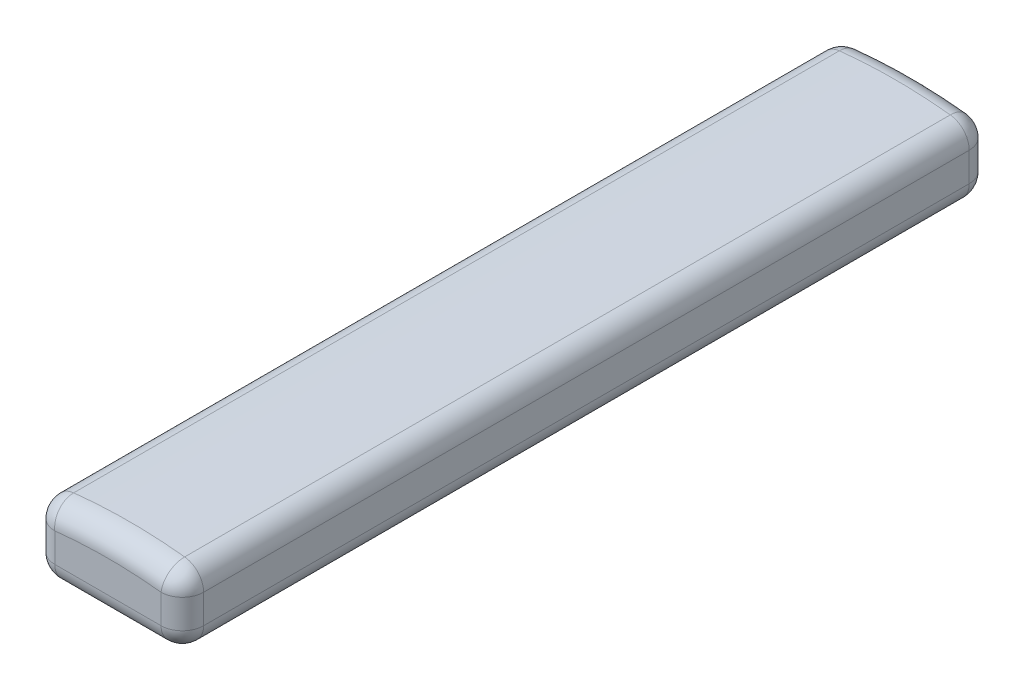
ISO-10303-21;
HEADER;
FILE_DESCRIPTION(('STEP AP214'),'2;1');
FILE_NAME('part.step','',(''),(''),'','','');
FILE_SCHEMA(('AUTOMOTIVE_DESIGN { 1 0 10303 214 1 1 1 1 }'));
ENDSEC;
DATA;
#1=APPLICATION_CONTEXT('core data for automotive mechanical design processes');
#2=APPLICATION_PROTOCOL_DEFINITION('international standard','automotive_design',2000,#1);
#3=PRODUCT_CONTEXT('',#1,'mechanical');
#4=PRODUCT('Part','Part','',(#3));
#5=PRODUCT_RELATED_PRODUCT_CATEGORY('part','',(#4));
#6=PRODUCT_DEFINITION_FORMATION('','',#4);
#7=PRODUCT_DEFINITION_CONTEXT('part definition',#1,'design');
#8=PRODUCT_DEFINITION('design','',#6,#7);
#9=PRODUCT_DEFINITION_SHAPE('','',#8);
#10=(LENGTH_UNIT() NAMED_UNIT(*) SI_UNIT(.MILLI.,.METRE.));
#11=(NAMED_UNIT(*) PLANE_ANGLE_UNIT() SI_UNIT($,.RADIAN.));
#12=(NAMED_UNIT(*) SI_UNIT($,.STERADIAN.) SOLID_ANGLE_UNIT());
#13=UNCERTAINTY_MEASURE_WITH_UNIT(LENGTH_MEASURE(1.E-05),#10,'distance_accuracy_value','');
#14=(GEOMETRIC_REPRESENTATION_CONTEXT(3) GLOBAL_UNCERTAINTY_ASSIGNED_CONTEXT((#13)) GLOBAL_UNIT_ASSIGNED_CONTEXT((#10,
#11,#12)) REPRESENTATION_CONTEXT('',''));
#15=CARTESIAN_POINT('',(0.,0.,0.));
#16=DIRECTION('',(0.,0.,1.));
#17=DIRECTION('',(1.,0.,0.));
#18=AXIS2_PLACEMENT_3D('',#15,#16,#17);
#19=CARTESIAN_POINT('',(3.5,-1.75,38.));
#20=DIRECTION('',(-1.,0.,0.));
#21=DIRECTION('',(0.,0.,1.));
#22=AXIS2_PLACEMENT_3D('',#19,#20,#21);
#23=PLANE('',#22);
#24=DIRECTION('',(0.,0.,-1.));
#25=VECTOR('',#24,1.);
#26=CARTESIAN_POINT('',(3.5,-0.75,38.));
#27=LINE('',#26,#25);
#28=CARTESIAN_POINT('',(3.5,-0.75,37.));
#29=VERTEX_POINT('',#28);
#30=CARTESIAN_POINT('',(3.5,-0.75,1.));
#31=VERTEX_POINT('',#30);
#32=EDGE_CURVE('E277',#29,#31,#27,.T.);
#33=ORIENTED_EDGE('',*,*,#32,.T.);
#34=DIRECTION('',(0.,1.,0.));
#35=VECTOR('',#34,1.);
#36=CARTESIAN_POINT('',(3.5,1.49342014116754,1.));
#37=LINE('',#36,#35);
#38=CARTESIAN_POINT('',(3.5,0.613726730347357,1.));
#39=VERTEX_POINT('',#38);
#40=EDGE_CURVE('E156',#31,#39,#37,.T.);
#41=ORIENTED_EDGE('',*,*,#40,.T.);
#42=DIRECTION('',(0.,0.,-1.));
#43=VECTOR('',#42,1.);
#44=CARTESIAN_POINT('',(3.5,0.613726730347357,38.));
#45=LINE('',#44,#43);
#46=CARTESIAN_POINT('',(3.5,0.613726730347357,37.));
#47=VERTEX_POINT('',#46);
#48=EDGE_CURVE('E284',#39,#47,#45,.F.);
#49=ORIENTED_EDGE('',*,*,#48,.T.);
#50=DIRECTION('',(0.,1.,0.));
#51=VECTOR('',#50,1.);
#52=CARTESIAN_POINT('',(3.5,-1.75,37.));
#53=LINE('',#52,#51);
#54=EDGE_CURVE('E279',#47,#29,#53,.F.);
#55=ORIENTED_EDGE('',*,*,#54,.T.);
#56=EDGE_LOOP('',(#33,#41,#49,#55));
#57=FACE_BOUND('',#56,.T.);
#58=ADVANCED_FACE('F36',(#57),#23,.F.);
#59=CARTESIAN_POINT('',(-3.5,-1.75,38.));
#60=DIRECTION('',(1.,0.,0.));
#61=DIRECTION('',(0.,0.,-1.));
#62=AXIS2_PLACEMENT_3D('',#59,#60,#61);
#63=PLANE('',#62);
#64=DIRECTION('',(0.,0.,-1.));
#65=VECTOR('',#64,1.);
#66=CARTESIAN_POINT('',(-3.5,0.613726730347357,0.));
#67=LINE('',#66,#65);
#68=CARTESIAN_POINT('',(-3.5,0.613726730347357,37.));
#69=VERTEX_POINT('',#68);
#70=CARTESIAN_POINT('',(-3.5,0.613726730347357,1.));
#71=VERTEX_POINT('',#70);
#72=EDGE_CURVE('E220',#69,#71,#67,.T.);
#73=ORIENTED_EDGE('',*,*,#72,.T.);
#74=DIRECTION('',(0.,-1.,0.));
#75=VECTOR('',#74,1.);
#76=CARTESIAN_POINT('',(-3.5,-1.75,1.));
#77=LINE('',#76,#75);
#78=CARTESIAN_POINT('',(-3.5,-0.75,1.));
#79=VERTEX_POINT('',#78);
#80=EDGE_CURVE('E223',#71,#79,#77,.T.);
#81=ORIENTED_EDGE('',*,*,#80,.T.);
#82=DIRECTION('',(0.,0.,-1.));
#83=VECTOR('',#82,1.);
#84=CARTESIAN_POINT('',(-3.5,-0.75,38.));
#85=LINE('',#84,#83);
#86=CARTESIAN_POINT('',(-3.5,-0.75,37.));
#87=VERTEX_POINT('',#86);
#88=EDGE_CURVE('E221',#79,#87,#85,.F.);
#89=ORIENTED_EDGE('',*,*,#88,.T.);
#90=DIRECTION('',(0.,-1.,0.));
#91=VECTOR('',#90,1.);
#92=CARTESIAN_POINT('',(-3.5,-1.75,37.));
#93=LINE('',#92,#91);
#94=EDGE_CURVE('E217',#87,#69,#93,.F.);
#95=ORIENTED_EDGE('',*,*,#94,.T.);
#96=EDGE_LOOP('',(#73,#81,#89,#95));
#97=FACE_BOUND('',#96,.T.);
#98=ADVANCED_FACE('F307',(#97),#63,.F.);
#99=CARTESIAN_POINT('',(0.,0.,38.));
#100=DIRECTION('',(0.,0.,-1.));
#101=DIRECTION('',(-1.,0.,0.));
#102=AXIS2_PLACEMENT_3D('',#99,#100,#101);
#103=PLANE('',#102);
#104=DIRECTION('',(0.,1.,0.));
#105=VECTOR('',#104,1.);
#106=CARTESIAN_POINT('',(2.5,0.,38.));
#107=LINE('',#106,#105);
#108=CARTESIAN_POINT('',(2.5,-0.75,38.));
#109=VERTEX_POINT('',#108);
#110=CARTESIAN_POINT('',(2.5,0.613726730347354,38.));
#111=VERTEX_POINT('',#110);
#112=EDGE_CURVE('E233',#109,#111,#107,.T.);
#113=ORIENTED_EDGE('',*,*,#112,.T.);
#114=CARTESIAN_POINT('',(0.,-22.25,38.));
#115=DIRECTION('',(0.,0.,-1.));
#116=DIRECTION('',(-1.,0.,0.));
#117=AXIS2_PLACEMENT_3D('',#114,#115,#116);
#118=CIRCLE('',#117,23.);
#119=CARTESIAN_POINT('',(-2.5,0.613726730347354,38.));
#120=VERTEX_POINT('',#119);
#121=EDGE_CURVE('E236',#111,#120,#118,.F.);
#122=ORIENTED_EDGE('',*,*,#121,.T.);
#123=DIRECTION('',(0.,-1.,0.));
#124=VECTOR('',#123,1.);
#125=CARTESIAN_POINT('',(-2.5,0.,38.));
#126=LINE('',#125,#124);
#127=CARTESIAN_POINT('',(-2.5,-0.75,38.));
#128=VERTEX_POINT('',#127);
#129=EDGE_CURVE('E215',#120,#128,#126,.T.);
#130=ORIENTED_EDGE('',*,*,#129,.T.);
#131=DIRECTION('',(1.,0.,0.));
#132=VECTOR('',#131,1.);
#133=CARTESIAN_POINT('',(0.,-0.75,38.));
#134=LINE('',#133,#132);
#135=EDGE_CURVE('E230',#128,#109,#134,.T.);
#136=ORIENTED_EDGE('',*,*,#135,.T.);
#137=EDGE_LOOP('',(#113,#122,#130,#136));
#138=FACE_BOUND('',#137,.T.);
#139=ADVANCED_FACE('F298',(#138),#103,.F.);
#140=CARTESIAN_POINT('',(0.,0.,0.));
#141=DIRECTION('',(0.,0.,-1.));
#142=DIRECTION('',(-1.,0.,0.));
#143=AXIS2_PLACEMENT_3D('',#140,#141,#142);
#144=PLANE('',#143);
#145=DIRECTION('',(0.,-1.,0.));
#146=VECTOR('',#145,1.);
#147=CARTESIAN_POINT('',(-2.5,1.49342014116754,0.));
#148=LINE('',#147,#146);
#149=CARTESIAN_POINT('',(-2.5,-0.75,0.));
#150=VERTEX_POINT('',#149);
#151=CARTESIAN_POINT('',(-2.5,0.613726730347354,0.));
#152=VERTEX_POINT('',#151);
#153=EDGE_CURVE('E134',#150,#152,#148,.F.);
#154=ORIENTED_EDGE('',*,*,#153,.T.);
#155=CARTESIAN_POINT('',(0.,-22.25,0.));
#156=DIRECTION('',(0.,0.,-1.));
#157=DIRECTION('',(-1.,0.,0.));
#158=AXIS2_PLACEMENT_3D('',#155,#156,#157);
#159=CIRCLE('',#158,23.);
#160=CARTESIAN_POINT('',(2.5,0.613726730347354,0.));
#161=VERTEX_POINT('',#160);
#162=EDGE_CURVE('E130',#152,#161,#159,.T.);
#163=ORIENTED_EDGE('',*,*,#162,.T.);
#164=DIRECTION('',(0.,1.,0.));
#165=VECTOR('',#164,1.);
#166=CARTESIAN_POINT('',(2.5,-1.75,0.));
#167=LINE('',#166,#165);
#168=CARTESIAN_POINT('',(2.5,-0.75,0.));
#169=VERTEX_POINT('',#168);
#170=EDGE_CURVE('E124',#161,#169,#167,.F.);
#171=ORIENTED_EDGE('',*,*,#170,.T.);
#172=DIRECTION('',(1.,0.,0.));
#173=VECTOR('',#172,1.);
#174=CARTESIAN_POINT('',(-3.5,-0.75,0.));
#175=LINE('',#174,#173);
#176=EDGE_CURVE('E127',#169,#150,#175,.F.);
#177=ORIENTED_EDGE('',*,*,#176,.T.);
#178=EDGE_LOOP('',(#154,#163,#171,#177));
#179=FACE_BOUND('',#178,.T.);
#180=ADVANCED_FACE('F126',(#179),#144,.T.);
#181=CARTESIAN_POINT('',(-3.5,-1.75,38.));
#182=DIRECTION('',(0.,1.,0.));
#183=DIRECTION('',(0.,0.,1.));
#184=AXIS2_PLACEMENT_3D('',#181,#182,#183);
#185=PLANE('',#184);
#186=DIRECTION('',(1.,0.,0.));
#187=VECTOR('',#186,1.);
#188=CARTESIAN_POINT('',(-3.5,-1.75,37.));
#189=LINE('',#188,#187);
#190=CARTESIAN_POINT('',(2.5,-1.75,37.));
#191=VERTEX_POINT('',#190);
#192=CARTESIAN_POINT('',(-2.5,-1.75,37.));
#193=VERTEX_POINT('',#192);
#194=EDGE_CURVE('E45',#191,#193,#189,.F.);
#195=ORIENTED_EDGE('',*,*,#194,.T.);
#196=DIRECTION('',(0.,0.,-1.));
#197=VECTOR('',#196,1.);
#198=CARTESIAN_POINT('',(-2.5,-1.75,38.));
#199=LINE('',#198,#197);
#200=CARTESIAN_POINT('',(-2.5,-1.75,1.));
#201=VERTEX_POINT('',#200);
#202=EDGE_CURVE('E11',#193,#201,#199,.T.);
#203=ORIENTED_EDGE('',*,*,#202,.T.);
#204=DIRECTION('',(1.,0.,0.));
#205=VECTOR('',#204,1.);
#206=CARTESIAN_POINT('',(3.5,-1.75,1.));
#207=LINE('',#206,#205);
#208=CARTESIAN_POINT('',(2.5,-1.75,1.));
#209=VERTEX_POINT('',#208);
#210=EDGE_CURVE('E238',#201,#209,#207,.T.);
#211=ORIENTED_EDGE('',*,*,#210,.T.);
#212=DIRECTION('',(0.,0.,-1.));
#213=VECTOR('',#212,1.);
#214=CARTESIAN_POINT('',(2.5,-1.75,38.));
#215=LINE('',#214,#213);
#216=EDGE_CURVE('E56',#209,#191,#215,.F.);
#217=ORIENTED_EDGE('',*,*,#216,.T.);
#218=EDGE_LOOP('',(#195,#203,#211,#217));
#219=FACE_BOUND('',#218,.T.);
#220=ADVANCED_FACE('F304',(#219),#185,.F.);
#221=CARTESIAN_POINT('',(0.,-22.25,0.));
#222=DIRECTION('',(0.,0.,1.));
#223=DIRECTION('',(1.,0.,0.));
#224=AXIS2_PLACEMENT_3D('',#221,#222,#223);
#225=CYLINDRICAL_SURFACE('',#224,24.);
#226=DIRECTION('',(0.,0.,1.));
#227=VECTOR('',#226,1.);
#228=CARTESIAN_POINT('',(2.60869565217391,1.60780180557985,0.));
#229=LINE('',#228,#227);
#230=CARTESIAN_POINT('',(2.60869565217391,1.60780180557985,37.));
#231=VERTEX_POINT('',#230);
#232=CARTESIAN_POINT('',(2.60869565217391,1.60780180557985,1.));
#233=VERTEX_POINT('',#232);
#234=EDGE_CURVE('E267',#231,#233,#229,.F.);
#235=ORIENTED_EDGE('',*,*,#234,.T.);
#236=CARTESIAN_POINT('',(0.,-22.25,1.));
#237=DIRECTION('',(0.,0.,-1.));
#238=DIRECTION('',(-1.,0.,0.));
#239=AXIS2_PLACEMENT_3D('',#236,#237,#238);
#240=CIRCLE('',#239,24.);
#241=CARTESIAN_POINT('',(-2.60869565217391,1.60780180557985,1.));
#242=VERTEX_POINT('',#241);
#243=EDGE_CURVE('E271',#233,#242,#240,.F.);
#244=ORIENTED_EDGE('',*,*,#243,.T.);
#245=DIRECTION('',(0.,0.,1.));
#246=VECTOR('',#245,1.);
#247=CARTESIAN_POINT('',(-2.60869565217391,1.60780180557985,0.));
#248=LINE('',#247,#246);
#249=CARTESIAN_POINT('',(-2.60869565217391,1.60780180557985,37.));
#250=VERTEX_POINT('',#249);
#251=EDGE_CURVE('E262',#242,#250,#248,.T.);
#252=ORIENTED_EDGE('',*,*,#251,.T.);
#253=CARTESIAN_POINT('',(0.,-22.25,37.));
#254=DIRECTION('',(0.,0.,-1.));
#255=DIRECTION('',(-1.,0.,0.));
#256=AXIS2_PLACEMENT_3D('',#253,#254,#255);
#257=CIRCLE('',#256,24.);
#258=EDGE_CURVE('E268',#250,#231,#257,.T.);
#259=ORIENTED_EDGE('',*,*,#258,.T.);
#260=EDGE_LOOP('',(#235,#244,#252,#259));
#261=FACE_BOUND('',#260,.T.);
#262=ADVANCED_FACE('F272',(#261),#225,.T.);
#263=CARTESIAN_POINT('',(0.,-0.75,37.));
#264=DIRECTION('',(1.,0.,0.));
#265=DIRECTION('',(0.,0.,-1.));
#266=AXIS2_PLACEMENT_3D('',#263,#264,#265);
#267=CYLINDRICAL_SURFACE('',#266,1.);
#268=CARTESIAN_POINT('',(-2.5,-0.75,37.));
#269=DIRECTION('',(-1.,0.,0.));
#270=DIRECTION('',(0.,0.,1.));
#271=AXIS2_PLACEMENT_3D('',#268,#269,#270);
#272=CIRCLE('',#271,1.);
#273=EDGE_CURVE('E40',#193,#128,#272,.T.);
#274=ORIENTED_EDGE('',*,*,#273,.F.);
#275=ORIENTED_EDGE('',*,*,#194,.F.);
#276=CARTESIAN_POINT('',(2.5,-0.75,37.));
#277=DIRECTION('',(1.,0.,0.));
#278=DIRECTION('',(0.,0.,-1.));
#279=AXIS2_PLACEMENT_3D('',#276,#277,#278);
#280=CIRCLE('',#279,1.);
#281=EDGE_CURVE('E196',#109,#191,#280,.T.);
#282=ORIENTED_EDGE('',*,*,#281,.F.);
#283=ORIENTED_EDGE('',*,*,#135,.F.);
#284=EDGE_LOOP('',(#274,#275,#282,#283));
#285=FACE_BOUND('',#284,.T.);
#286=ADVANCED_FACE('F38',(#285),#267,.T.);
#287=CARTESIAN_POINT('',(-2.5,-0.75,37.));
#288=DIRECTION('',(0.,0.,1.));
#289=DIRECTION('',(1.,0.,0.));
#290=AXIS2_PLACEMENT_3D('',#287,#288,#289);
#291=SPHERICAL_SURFACE('',#290,1.);
#292=CARTESIAN_POINT('',(-2.5,-0.75,37.));
#293=DIRECTION('',(0.,0.,1.));
#294=DIRECTION('',(1.,0.,0.));
#295=AXIS2_PLACEMENT_3D('',#292,#293,#294);
#296=CIRCLE('',#295,1.);
#297=EDGE_CURVE('E191',#193,#87,#296,.F.);
#298=ORIENTED_EDGE('',*,*,#297,.F.);
#299=ORIENTED_EDGE('',*,*,#273,.T.);
#300=CARTESIAN_POINT('',(-2.5,-0.75,37.));
#301=DIRECTION('',(0.,-1.,0.));
#302=DIRECTION('',(0.,0.,-1.));
#303=AXIS2_PLACEMENT_3D('',#300,#301,#302);
#304=CIRCLE('',#303,1.);
#305=EDGE_CURVE('E194',#87,#128,#304,.F.);
#306=ORIENTED_EDGE('',*,*,#305,.F.);
#307=EDGE_LOOP('',(#298,#299,#306));
#308=FACE_BOUND('',#307,.T.);
#309=ADVANCED_FACE('F206',(#308),#291,.T.);
#310=CARTESIAN_POINT('',(2.5,-0.75,37.));
#311=DIRECTION('',(0.,0.,1.));
#312=DIRECTION('',(1.,0.,0.));
#313=AXIS2_PLACEMENT_3D('',#310,#311,#312);
#314=SPHERICAL_SURFACE('',#313,1.);
#315=CARTESIAN_POINT('',(2.5,-0.75,37.));
#316=DIRECTION('',(0.,-1.,0.));
#317=DIRECTION('',(0.,0.,-1.));
#318=AXIS2_PLACEMENT_3D('',#315,#316,#317);
#319=CIRCLE('',#318,1.);
#320=EDGE_CURVE('E185',#109,#29,#319,.F.);
#321=ORIENTED_EDGE('',*,*,#320,.F.);
#322=ORIENTED_EDGE('',*,*,#281,.T.);
#323=CARTESIAN_POINT('',(2.5,-0.75,37.));
#324=DIRECTION('',(0.,0.,1.));
#325=DIRECTION('',(1.,0.,0.));
#326=AXIS2_PLACEMENT_3D('',#323,#324,#325);
#327=CIRCLE('',#326,1.);
#328=EDGE_CURVE('E188',#29,#191,#327,.F.);
#329=ORIENTED_EDGE('',*,*,#328,.F.);
#330=EDGE_LOOP('',(#321,#322,#329));
#331=FACE_BOUND('',#330,.T.);
#332=ADVANCED_FACE('F291',(#331),#314,.T.);
#333=CARTESIAN_POINT('',(-2.5,0.,37.));
#334=DIRECTION('',(0.,-1.,0.));
#335=DIRECTION('',(0.,0.,-1.));
#336=AXIS2_PLACEMENT_3D('',#333,#334,#335);
#337=CYLINDRICAL_SURFACE('',#336,1.);
#338=ORIENTED_EDGE('',*,*,#305,.T.);
#339=ORIENTED_EDGE('',*,*,#129,.F.);
#340=CARTESIAN_POINT('',(-2.5,0.613726730347357,37.));
#341=DIRECTION('',(0.,1.,0.));
#342=DIRECTION('',(0.,0.,1.));
#343=AXIS2_PLACEMENT_3D('',#340,#341,#342);
#344=CIRCLE('',#343,1.);
#345=EDGE_CURVE('E179',#69,#120,#344,.T.);
#346=ORIENTED_EDGE('',*,*,#345,.F.);
#347=ORIENTED_EDGE('',*,*,#94,.F.);
#348=EDGE_LOOP('',(#338,#339,#346,#347));
#349=FACE_BOUND('',#348,.T.);
#350=ADVANCED_FACE('F213',(#349),#337,.T.);
#351=CARTESIAN_POINT('',(-2.5,-0.75,38.));
#352=DIRECTION('',(0.,0.,-1.));
#353=DIRECTION('',(-1.,0.,0.));
#354=AXIS2_PLACEMENT_3D('',#351,#352,#353);
#355=CYLINDRICAL_SURFACE('',#354,1.);
#356=ORIENTED_EDGE('',*,*,#297,.T.);
#357=ORIENTED_EDGE('',*,*,#88,.F.);
#358=CARTESIAN_POINT('',(-2.5,-0.75,1.));
#359=DIRECTION('',(0.,0.,-1.));
#360=DIRECTION('',(-1.,0.,0.));
#361=AXIS2_PLACEMENT_3D('',#358,#359,#360);
#362=CIRCLE('',#361,1.);
#363=EDGE_CURVE('E176',#201,#79,#362,.T.);
#364=ORIENTED_EDGE('',*,*,#363,.F.);
#365=ORIENTED_EDGE('',*,*,#202,.F.);
#366=EDGE_LOOP('',(#356,#357,#364,#365));
#367=FACE_BOUND('',#366,.T.);
#368=ADVANCED_FACE('F360',(#367),#355,.T.);
#369=CARTESIAN_POINT('',(-3.5,-0.75,1.));
#370=DIRECTION('',(-1.,0.,0.));
#371=DIRECTION('',(0.,0.,1.));
#372=AXIS2_PLACEMENT_3D('',#369,#370,#371);
#373=CYLINDRICAL_SURFACE('',#372,1.);
#374=CARTESIAN_POINT('',(2.5,-0.75,1.));
#375=DIRECTION('',(1.,0.,0.));
#376=DIRECTION('',(0.,0.,-1.));
#377=AXIS2_PLACEMENT_3D('',#374,#375,#376);
#378=CIRCLE('',#377,1.);
#379=EDGE_CURVE('E141',#209,#169,#378,.T.);
#380=ORIENTED_EDGE('',*,*,#379,.F.);
#381=ORIENTED_EDGE('',*,*,#210,.F.);
#382=CARTESIAN_POINT('',(-2.5,-0.75,1.));
#383=DIRECTION('',(-1.,0.,0.));
#384=DIRECTION('',(0.,0.,1.));
#385=AXIS2_PLACEMENT_3D('',#382,#383,#384);
#386=CIRCLE('',#385,1.);
#387=EDGE_CURVE('E143',#150,#201,#386,.T.);
#388=ORIENTED_EDGE('',*,*,#387,.F.);
#389=ORIENTED_EDGE('',*,*,#176,.F.);
#390=EDGE_LOOP('',(#380,#381,#388,#389));
#391=FACE_BOUND('',#390,.T.);
#392=ADVANCED_FACE('F139',(#391),#373,.T.);
#393=CARTESIAN_POINT('',(2.5,-0.75,38.));
#394=DIRECTION('',(0.,0.,-1.));
#395=DIRECTION('',(-1.,0.,0.));
#396=AXIS2_PLACEMENT_3D('',#393,#394,#395);
#397=CYLINDRICAL_SURFACE('',#396,1.);
#398=ORIENTED_EDGE('',*,*,#328,.T.);
#399=ORIENTED_EDGE('',*,*,#216,.F.);
#400=CARTESIAN_POINT('',(2.5,-0.75,1.));
#401=DIRECTION('',(0.,0.,-1.));
#402=DIRECTION('',(-1.,0.,0.));
#403=AXIS2_PLACEMENT_3D('',#400,#401,#402);
#404=CIRCLE('',#403,1.);
#405=EDGE_CURVE('E152',#31,#209,#404,.T.);
#406=ORIENTED_EDGE('',*,*,#405,.F.);
#407=ORIENTED_EDGE('',*,*,#32,.F.);
#408=EDGE_LOOP('',(#398,#399,#406,#407));
#409=FACE_BOUND('',#408,.T.);
#410=ADVANCED_FACE('F290',(#409),#397,.T.);
#411=CARTESIAN_POINT('',(2.5,0.,37.));
#412=DIRECTION('',(0.,1.,0.));
#413=DIRECTION('',(0.,0.,1.));
#414=AXIS2_PLACEMENT_3D('',#411,#412,#413);
#415=CYLINDRICAL_SURFACE('',#414,1.);
#416=ORIENTED_EDGE('',*,*,#320,.T.);
#417=ORIENTED_EDGE('',*,*,#54,.F.);
#418=CARTESIAN_POINT('',(2.5,0.613726730347354,37.));
#419=DIRECTION('',(0.,1.,0.));
#420=DIRECTION('',(-1.,0.,0.));
#421=AXIS2_PLACEMENT_3D('',#418,#419,#420);
#422=CIRCLE('',#421,1.);
#423=EDGE_CURVE('E171',#111,#47,#422,.T.);
#424=ORIENTED_EDGE('',*,*,#423,.F.);
#425=ORIENTED_EDGE('',*,*,#112,.F.);
#426=EDGE_LOOP('',(#416,#417,#424,#425));
#427=FACE_BOUND('',#426,.T.);
#428=ADVANCED_FACE('F295',(#427),#415,.T.);
#429=CARTESIAN_POINT('',(0.,-22.25,37.));
#430=DIRECTION('',(0.,0.,-1.));
#431=DIRECTION('',(-1.,0.,0.));
#432=AXIS2_PLACEMENT_3D('',#429,#430,#431);
#433=TOROIDAL_SURFACE('',#432,23.,1.);
#434=CARTESIAN_POINT('',(-2.5,0.613726730347354,37.));
#435=DIRECTION('',(-0.994075075232494,-0.108695652173913,0.));
#436=DIRECTION('',(0.108695652173913,-0.994075075232494,0.));
#437=AXIS2_PLACEMENT_3D('',#434,#435,#436);
#438=CIRCLE('',#437,1.);
#439=EDGE_CURVE('E182',#120,#250,#438,.T.);
#440=ORIENTED_EDGE('',*,*,#439,.F.);
#441=ORIENTED_EDGE('',*,*,#121,.F.);
#442=CARTESIAN_POINT('',(2.5,0.613726730347356,37.));
#443=DIRECTION('',(0.994075075232494,-0.108695652173913,0.));
#444=DIRECTION('',(0.108695652173913,0.994075075232494,0.));
#445=AXIS2_PLACEMENT_3D('',#442,#443,#444);
#446=CIRCLE('',#445,1.);
#447=EDGE_CURVE('E169',#231,#111,#446,.T.);
#448=ORIENTED_EDGE('',*,*,#447,.F.);
#449=ORIENTED_EDGE('',*,*,#258,.F.);
#450=EDGE_LOOP('',(#440,#441,#448,#449));
#451=FACE_BOUND('',#450,.T.);
#452=ADVANCED_FACE('F349',(#451),#433,.T.);
#453=CARTESIAN_POINT('',(-2.5,0.613726730347356,37.));
#454=DIRECTION('',(0.,0.,1.));
#455=DIRECTION('',(1.,0.,0.));
#456=AXIS2_PLACEMENT_3D('',#453,#454,#455);
#457=SPHERICAL_SURFACE('',#456,1.);
#458=ORIENTED_EDGE('',*,*,#345,.T.);
#459=ORIENTED_EDGE('',*,*,#439,.T.);
#460=CARTESIAN_POINT('',(-2.5,0.613726730347356,37.));
#461=DIRECTION('',(0.,0.,1.));
#462=DIRECTION('',(1.,0.,0.));
#463=AXIS2_PLACEMENT_3D('',#460,#461,#462);
#464=CIRCLE('',#463,1.);
#465=EDGE_CURVE('E160',#69,#250,#464,.F.);
#466=ORIENTED_EDGE('',*,*,#465,.F.);
#467=EDGE_LOOP('',(#458,#459,#466));
#468=FACE_BOUND('',#467,.T.);
#469=ADVANCED_FACE('F345',(#468),#457,.T.);
#470=CARTESIAN_POINT('',(-2.5,-0.75,1.));
#471=DIRECTION('',(0.,0.,1.));
#472=DIRECTION('',(1.,0.,0.));
#473=AXIS2_PLACEMENT_3D('',#470,#471,#472);
#474=SPHERICAL_SURFACE('',#473,1.);
#475=ORIENTED_EDGE('',*,*,#387,.T.);
#476=ORIENTED_EDGE('',*,*,#363,.T.);
#477=CARTESIAN_POINT('',(-2.5,-0.75,1.));
#478=DIRECTION('',(0.,-1.,0.));
#479=DIRECTION('',(0.,0.,-1.));
#480=AXIS2_PLACEMENT_3D('',#477,#478,#479);
#481=CIRCLE('',#480,1.);
#482=EDGE_CURVE('E157',#150,#79,#481,.F.);
#483=ORIENTED_EDGE('',*,*,#482,.F.);
#484=EDGE_LOOP('',(#475,#476,#483));
#485=FACE_BOUND('',#484,.T.);
#486=ADVANCED_FACE('F342',(#485),#474,.T.);
#487=CARTESIAN_POINT('',(2.5,-0.75,1.));
#488=DIRECTION('',(0.,0.,1.));
#489=DIRECTION('',(1.,0.,0.));
#490=AXIS2_PLACEMENT_3D('',#487,#488,#489);
#491=SPHERICAL_SURFACE('',#490,1.);
#492=ORIENTED_EDGE('',*,*,#405,.T.);
#493=ORIENTED_EDGE('',*,*,#379,.T.);
#494=CARTESIAN_POINT('',(2.5,-0.75,1.));
#495=DIRECTION('',(0.,-1.,0.));
#496=DIRECTION('',(0.,0.,-1.));
#497=AXIS2_PLACEMENT_3D('',#494,#495,#496);
#498=CIRCLE('',#497,1.);
#499=EDGE_CURVE('E149',#31,#169,#498,.F.);
#500=ORIENTED_EDGE('',*,*,#499,.F.);
#501=EDGE_LOOP('',(#492,#493,#500));
#502=FACE_BOUND('',#501,.T.);
#503=ADVANCED_FACE('F148',(#502),#491,.T.);
#504=CARTESIAN_POINT('',(2.5,0.613726730347356,37.));
#505=DIRECTION('',(0.,0.,1.));
#506=DIRECTION('',(1.,0.,0.));
#507=AXIS2_PLACEMENT_3D('',#504,#505,#506);
#508=SPHERICAL_SURFACE('',#507,1.);
#509=ORIENTED_EDGE('',*,*,#447,.T.);
#510=ORIENTED_EDGE('',*,*,#423,.T.);
#511=CARTESIAN_POINT('',(2.5,0.613726730347357,37.));
#512=DIRECTION('',(0.,0.,1.));
#513=DIRECTION('',(1.,0.,0.));
#514=AXIS2_PLACEMENT_3D('',#511,#512,#513);
#515=CIRCLE('',#514,1.);
#516=EDGE_CURVE('E158',#231,#47,#515,.F.);
#517=ORIENTED_EDGE('',*,*,#516,.F.);
#518=EDGE_LOOP('',(#509,#510,#517));
#519=FACE_BOUND('',#518,.T.);
#520=ADVANCED_FACE('F336',(#519),#508,.T.);
#521=CARTESIAN_POINT('',(-2.5,0.613726730347357,0.));
#522=DIRECTION('',(0.,0.,1.));
#523=DIRECTION('',(1.,0.,0.));
#524=AXIS2_PLACEMENT_3D('',#521,#522,#523);
#525=CYLINDRICAL_SURFACE('',#524,1.);
#526=ORIENTED_EDGE('',*,*,#465,.T.);
#527=ORIENTED_EDGE('',*,*,#251,.F.);
#528=CARTESIAN_POINT('',(-2.5,0.613726730347357,1.));
#529=DIRECTION('',(0.,0.,-1.));
#530=DIRECTION('',(0.,1.,0.));
#531=AXIS2_PLACEMENT_3D('',#528,#529,#530);
#532=CIRCLE('',#531,1.);
#533=EDGE_CURVE('E163',#71,#242,#532,.T.);
#534=ORIENTED_EDGE('',*,*,#533,.F.);
#535=ORIENTED_EDGE('',*,*,#72,.F.);
#536=EDGE_LOOP('',(#526,#527,#534,#535));
#537=FACE_BOUND('',#536,.T.);
#538=ADVANCED_FACE('F264',(#537),#525,.T.);
#539=CARTESIAN_POINT('',(-2.5,-1.75,1.));
#540=DIRECTION('',(0.,1.,0.));
#541=DIRECTION('',(0.,0.,1.));
#542=AXIS2_PLACEMENT_3D('',#539,#540,#541);
#543=CYLINDRICAL_SURFACE('',#542,1.);
#544=ORIENTED_EDGE('',*,*,#482,.T.);
#545=ORIENTED_EDGE('',*,*,#80,.F.);
#546=CARTESIAN_POINT('',(-2.5,0.613726730347354,1.));
#547=DIRECTION('',(0.,1.,0.));
#548=DIRECTION('',(-1.,0.,0.));
#549=AXIS2_PLACEMENT_3D('',#546,#547,#548);
#550=CIRCLE('',#549,1.);
#551=EDGE_CURVE('E251',#152,#71,#550,.T.);
#552=ORIENTED_EDGE('',*,*,#551,.F.);
#553=ORIENTED_EDGE('',*,*,#153,.F.);
#554=EDGE_LOOP('',(#544,#545,#552,#553));
#555=FACE_BOUND('',#554,.T.);
#556=ADVANCED_FACE('F330',(#555),#543,.T.);
#557=CARTESIAN_POINT('',(2.5,-1.75,1.));
#558=DIRECTION('',(0.,-1.,0.));
#559=DIRECTION('',(0.,0.,-1.));
#560=AXIS2_PLACEMENT_3D('',#557,#558,#559);
#561=CYLINDRICAL_SURFACE('',#560,1.);
#562=ORIENTED_EDGE('',*,*,#499,.T.);
#563=ORIENTED_EDGE('',*,*,#170,.F.);
#564=CARTESIAN_POINT('',(2.5,0.613726730347357,1.));
#565=DIRECTION('',(0.,1.,0.));
#566=DIRECTION('',(0.,0.,1.));
#567=AXIS2_PLACEMENT_3D('',#564,#565,#566);
#568=CIRCLE('',#567,1.);
#569=EDGE_CURVE('E248',#39,#161,#568,.T.);
#570=ORIENTED_EDGE('',*,*,#569,.F.);
#571=ORIENTED_EDGE('',*,*,#40,.F.);
#572=EDGE_LOOP('',(#562,#563,#570,#571));
#573=FACE_BOUND('',#572,.T.);
#574=ADVANCED_FACE('F154',(#573),#561,.T.);
#575=CARTESIAN_POINT('',(2.5,0.613726730347357,0.));
#576=DIRECTION('',(0.,0.,1.));
#577=DIRECTION('',(1.,0.,0.));
#578=AXIS2_PLACEMENT_3D('',#575,#576,#577);
#579=CYLINDRICAL_SURFACE('',#578,1.);
#580=ORIENTED_EDGE('',*,*,#516,.T.);
#581=ORIENTED_EDGE('',*,*,#48,.F.);
#582=CARTESIAN_POINT('',(2.5,0.613726730347356,1.));
#583=DIRECTION('',(0.,0.,-1.));
#584=DIRECTION('',(-1.,0.,0.));
#585=AXIS2_PLACEMENT_3D('',#582,#583,#584);
#586=CIRCLE('',#585,1.);
#587=EDGE_CURVE('E246',#233,#39,#586,.T.);
#588=ORIENTED_EDGE('',*,*,#587,.F.);
#589=ORIENTED_EDGE('',*,*,#234,.F.);
#590=EDGE_LOOP('',(#580,#581,#588,#589));
#591=FACE_BOUND('',#590,.T.);
#592=ADVANCED_FACE('F324',(#591),#579,.T.);
#593=CARTESIAN_POINT('',(-2.5,0.613726730347356,1.));
#594=DIRECTION('',(0.,0.,1.));
#595=DIRECTION('',(1.,0.,0.));
#596=AXIS2_PLACEMENT_3D('',#593,#594,#595);
#597=SPHERICAL_SURFACE('',#596,1.);
#598=ORIENTED_EDGE('',*,*,#551,.T.);
#599=ORIENTED_EDGE('',*,*,#533,.T.);
#600=CARTESIAN_POINT('',(-2.5,0.613726730347356,1.));
#601=DIRECTION('',(-0.994075075232493,-0.108695652173913,0.));
#602=DIRECTION('',(0.108695652173913,-0.994075075232494,0.));
#603=AXIS2_PLACEMENT_3D('',#600,#601,#602);
#604=CIRCLE('',#603,1.);
#605=EDGE_CURVE('E244',#152,#242,#604,.F.);
#606=ORIENTED_EDGE('',*,*,#605,.F.);
#607=EDGE_LOOP('',(#598,#599,#606));
#608=FACE_BOUND('',#607,.T.);
#609=ADVANCED_FACE('F258',(#608),#597,.T.);
#610=CARTESIAN_POINT('',(2.5,0.613726730347356,1.));
#611=DIRECTION('',(0.,0.,1.));
#612=DIRECTION('',(1.,0.,0.));
#613=AXIS2_PLACEMENT_3D('',#610,#611,#612);
#614=SPHERICAL_SURFACE('',#613,1.);
#615=ORIENTED_EDGE('',*,*,#587,.T.);
#616=ORIENTED_EDGE('',*,*,#569,.T.);
#617=CARTESIAN_POINT('',(2.5,0.613726730347354,1.));
#618=DIRECTION('',(0.994075075232494,-0.108695652173912,0.));
#619=DIRECTION('',(0.108695652173912,0.994075075232494,0.));
#620=AXIS2_PLACEMENT_3D('',#617,#618,#619);
#621=CIRCLE('',#620,1.);
#622=EDGE_CURVE('E242',#233,#161,#621,.F.);
#623=ORIENTED_EDGE('',*,*,#622,.F.);
#624=EDGE_LOOP('',(#615,#616,#623));
#625=FACE_BOUND('',#624,.T.);
#626=ADVANCED_FACE('F318',(#625),#614,.T.);
#627=CARTESIAN_POINT('',(0.,-22.25,1.));
#628=DIRECTION('',(0.,0.,-1.));
#629=DIRECTION('',(-1.,0.,0.));
#630=AXIS2_PLACEMENT_3D('',#627,#628,#629);
#631=TOROIDAL_SURFACE('',#630,23.,1.);
#632=ORIENTED_EDGE('',*,*,#605,.T.);
#633=ORIENTED_EDGE('',*,*,#243,.F.);
#634=ORIENTED_EDGE('',*,*,#622,.T.);
#635=ORIENTED_EDGE('',*,*,#162,.F.);
#636=EDGE_LOOP('',(#632,#633,#634,#635));
#637=FACE_BOUND('',#636,.T.);
#638=ADVANCED_FACE('F315',(#637),#631,.T.);
#639=CLOSED_SHELL('',(#58,#98,#139,#180,#220,#262,#286,#309,#332,#350,#368,#392,#410,#428,#452,
#469,#486,#503,#520,#538,#556,#574,#592,#609,#626,#638));
#640=MANIFOLD_SOLID_BREP('B2',#639);
#641=ADVANCED_BREP_SHAPE_REPRESENTATION('',(#18,#640),#14);
#642=SHAPE_DEFINITION_REPRESENTATION(#9,#641);
ENDSEC;
END-ISO-10303-21;
